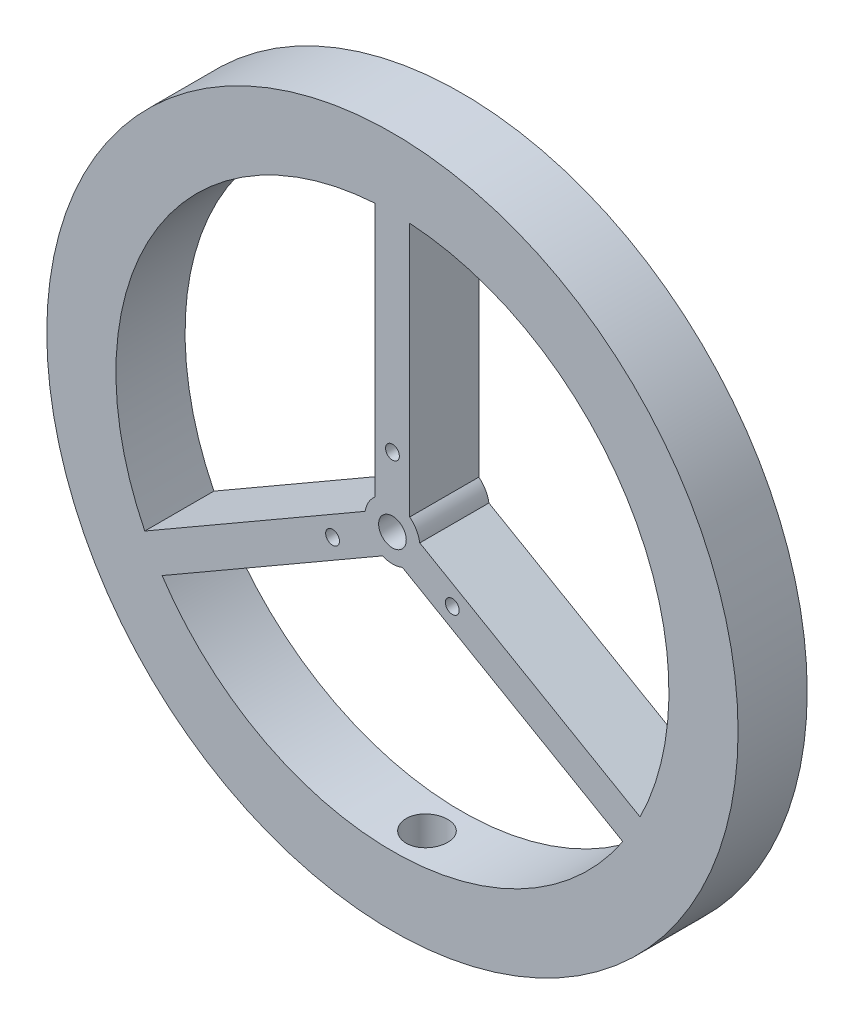
ISO-10303-21;
HEADER;
FILE_DESCRIPTION(('STEP AP214'),'2;1');
FILE_NAME('part.step','',(''),(''),'','','');
FILE_SCHEMA(('AUTOMOTIVE_DESIGN { 1 0 10303 214 1 1 1 1 }'));
ENDSEC;
DATA;
#1=APPLICATION_CONTEXT('core data for automotive mechanical design processes');
#2=APPLICATION_PROTOCOL_DEFINITION('international standard','automotive_design',2000,#1);
#3=PRODUCT_CONTEXT('',#1,'mechanical');
#4=PRODUCT('Part','Part','',(#3));
#5=PRODUCT_RELATED_PRODUCT_CATEGORY('part','',(#4));
#6=PRODUCT_DEFINITION_FORMATION('','',#4);
#7=PRODUCT_DEFINITION_CONTEXT('part definition',#1,'design');
#8=PRODUCT_DEFINITION('design','',#6,#7);
#9=PRODUCT_DEFINITION_SHAPE('','',#8);
#10=(LENGTH_UNIT() NAMED_UNIT(*) SI_UNIT(.MILLI.,.METRE.));
#11=(NAMED_UNIT(*) PLANE_ANGLE_UNIT() SI_UNIT($,.RADIAN.));
#12=(NAMED_UNIT(*) SI_UNIT($,.STERADIAN.) SOLID_ANGLE_UNIT());
#13=UNCERTAINTY_MEASURE_WITH_UNIT(LENGTH_MEASURE(1.E-05),#10,'distance_accuracy_value','');
#14=(GEOMETRIC_REPRESENTATION_CONTEXT(3) GLOBAL_UNCERTAINTY_ASSIGNED_CONTEXT((#13)) GLOBAL_UNIT_ASSIGNED_CONTEXT((#10,
#11,#12)) REPRESENTATION_CONTEXT('',''));
#15=CARTESIAN_POINT('',(0.,0.,0.));
#16=DIRECTION('',(0.,0.,1.));
#17=DIRECTION('',(1.,0.,0.));
#18=AXIS2_PLACEMENT_3D('',#15,#16,#17);
#19=CARTESIAN_POINT('',(0.,0.,10.));
#20=DIRECTION('',(0.,0.,1.));
#21=DIRECTION('',(1.,0.,0.));
#22=AXIS2_PLACEMENT_3D('',#19,#20,#21);
#23=PLANE('',#22);
#24=CARTESIAN_POINT('',(-8.66025403784439,-5.,10.));
#25=DIRECTION('',(0.,0.,1.));
#26=DIRECTION('',(1.,0.,0.));
#27=AXIS2_PLACEMENT_3D('',#24,#25,#26);
#28=CIRCLE('',#27,1.);
#29=CARTESIAN_POINT('',(-7.66025403784438,-5.,10.));
#30=VERTEX_POINT('',#29);
#31=EDGE_CURVE('E164',#30,#30,#28,.T.);
#32=ORIENTED_EDGE('',*,*,#31,.F.);
#33=EDGE_LOOP('',(#32));
#34=FACE_BOUND('',#33,.T.);
#35=CARTESIAN_POINT('',(0.,0.,10.));
#36=DIRECTION('',(0.,0.,1.));
#37=DIRECTION('',(1.,0.,0.));
#38=AXIS2_PLACEMENT_3D('',#35,#36,#37);
#39=CIRCLE('',#38,2.);
#40=CARTESIAN_POINT('',(2.,0.,10.));
#41=VERTEX_POINT('',#40);
#42=EDGE_CURVE('E407',#41,#41,#39,.T.);
#43=ORIENTED_EDGE('',*,*,#42,.F.);
#44=EDGE_LOOP('',(#43));
#45=FACE_BOUND('',#44,.T.);
#46=CARTESIAN_POINT('',(0.,10.,10.));
#47=DIRECTION('',(0.,0.,1.));
#48=DIRECTION('',(1.,0.,0.));
#49=AXIS2_PLACEMENT_3D('',#46,#47,#48);
#50=CIRCLE('',#49,1.);
#51=CARTESIAN_POINT('',(1.,10.,10.));
#52=VERTEX_POINT('',#51);
#53=EDGE_CURVE('E418',#52,#52,#50,.T.);
#54=ORIENTED_EDGE('',*,*,#53,.F.);
#55=EDGE_LOOP('',(#54));
#56=FACE_BOUND('',#55,.T.);
#57=CARTESIAN_POINT('',(8.66025403784439,-5.,10.));
#58=DIRECTION('',(0.,0.,1.));
#59=DIRECTION('',(1.,0.,0.));
#60=AXIS2_PLACEMENT_3D('',#57,#58,#59);
#61=CIRCLE('',#60,1.);
#62=CARTESIAN_POINT('',(9.66025403784439,-5.,10.));
#63=VERTEX_POINT('',#62);
#64=EDGE_CURVE('E406',#63,#63,#61,.T.);
#65=ORIENTED_EDGE('',*,*,#64,.F.);
#66=EDGE_LOOP('',(#65));
#67=FACE_BOUND('',#66,.T.);
#68=CARTESIAN_POINT('',(0.,0.,10.));
#69=DIRECTION('',(0.,0.,1.));
#70=DIRECTION('',(1.,0.,0.));
#71=AXIS2_PLACEMENT_3D('',#68,#69,#70);
#72=CIRCLE('',#71,50.);
#73=CARTESIAN_POINT('',(50.,0.,10.));
#74=VERTEX_POINT('',#73);
#75=EDGE_CURVE('E11',#74,#74,#72,.T.);
#76=ORIENTED_EDGE('',*,*,#75,.T.);
#77=EDGE_LOOP('',(#76));
#78=FACE_BOUND('',#77,.T.);
#79=DIRECTION('',(0.,-1.,0.));
#80=VECTOR('',#79,1.);
#81=CARTESIAN_POINT('',(2.5,39.9217985566783,10.));
#82=LINE('',#81,#80);
#83=CARTESIAN_POINT('',(2.5,39.9217985566783,10.));
#84=VERTEX_POINT('',#83);
#85=CARTESIAN_POINT('',(2.50000000000001,3.12249899919919,10.));
#86=VERTEX_POINT('',#85);
#87=EDGE_CURVE('E207',#84,#86,#82,.T.);
#88=ORIENTED_EDGE('',*,*,#87,.F.);
#89=CARTESIAN_POINT('',(0.,0.,10.));
#90=DIRECTION('',(0.,0.,1.));
#91=DIRECTION('',(1.,0.,0.));
#92=AXIS2_PLACEMENT_3D('',#89,#90,#91);
#93=CIRCLE('',#92,40.);
#94=CARTESIAN_POINT('',(35.823291714858,-17.7958357688586,10.));
#95=VERTEX_POINT('',#94);
#96=EDGE_CURVE('E205',#95,#84,#93,.T.);
#97=ORIENTED_EDGE('',*,*,#96,.F.);
#98=DIRECTION('',(0.866025403784695,-0.499999999999557,0.));
#99=VECTOR('',#98,1.);
#100=CARTESIAN_POINT('',(3.95416345659744,0.603814009865113,10.));
#101=LINE('',#100,#99);
#102=CARTESIAN_POINT('',(3.95416345659744,0.603814009865113,10.));
#103=VERTEX_POINT('',#102);
#104=EDGE_CURVE('E213',#103,#95,#101,.T.);
#105=ORIENTED_EDGE('',*,*,#104,.F.);
#106=CARTESIAN_POINT('',(0.,0.,10.));
#107=DIRECTION('',(0.,0.,-1.));
#108=DIRECTION('',(1.,0.,0.));
#109=AXIS2_PLACEMENT_3D('',#106,#107,#108);
#110=CIRCLE('',#109,4.);
#111=EDGE_CURVE('E210',#86,#103,#110,.T.);
#112=ORIENTED_EDGE('',*,*,#111,.F.);
#113=EDGE_LOOP('',(#88,#97,#105,#112));
#114=FACE_BOUND('',#113,.T.);
#115=DIRECTION('',(0.866025403784042,0.500000000000687,0.));
#116=VECTOR('',#115,1.);
#117=CARTESIAN_POINT('',(-35.8232917148353,-17.7958357689042,10.));
#118=LINE('',#117,#116);
#119=CARTESIAN_POINT('',(-35.8232917148353,-17.7958357689042,10.));
#120=VERTEX_POINT('',#119);
#121=CARTESIAN_POINT('',(-3.95416345659799,0.6038140098615,10.));
#122=VERTEX_POINT('',#121);
#123=EDGE_CURVE('E176',#120,#122,#118,.T.);
#124=ORIENTED_EDGE('',*,*,#123,.F.);
#125=CARTESIAN_POINT('',(0.,0.,10.));
#126=DIRECTION('',(0.,0.,1.));
#127=DIRECTION('',(1.,0.,0.));
#128=AXIS2_PLACEMENT_3D('',#125,#126,#127);
#129=CIRCLE('',#128,40.);
#130=CARTESIAN_POINT('',(-2.49999999998372,39.9217985566793,10.));
#131=VERTEX_POINT('',#130);
#132=EDGE_CURVE('E174',#131,#120,#129,.T.);
#133=ORIENTED_EDGE('',*,*,#132,.F.);
#134=DIRECTION('',(0.,1.,0.));
#135=VECTOR('',#134,1.);
#136=CARTESIAN_POINT('',(-2.49999999998372,39.9217985566793,10.));
#137=LINE('',#136,#135);
#138=CARTESIAN_POINT('',(-2.49999999998372,3.12249899921223,10.));
#139=VERTEX_POINT('',#138);
#140=EDGE_CURVE('E182',#139,#131,#137,.T.);
#141=ORIENTED_EDGE('',*,*,#140,.F.);
#142=CARTESIAN_POINT('',(0.,0.,10.));
#143=DIRECTION('',(0.,0.,-1.));
#144=DIRECTION('',(1.,0.,0.));
#145=AXIS2_PLACEMENT_3D('',#142,#143,#144);
#146=CIRCLE('',#145,4.);
#147=EDGE_CURVE('E179',#122,#139,#146,.T.);
#148=ORIENTED_EDGE('',*,*,#147,.F.);
#149=EDGE_LOOP('',(#124,#133,#141,#148));
#150=FACE_BOUND('',#149,.T.);
#151=DIRECTION('',(-0.866025403784695,0.499999999999557,0.));
#152=VECTOR('',#151,1.);
#153=CARTESIAN_POINT('',(33.3232917148584,-22.125962787785,10.));
#154=LINE('',#153,#152);
#155=CARTESIAN_POINT('',(33.3232917148584,-22.125962787785,10.));
#156=VERTEX_POINT('',#155);
#157=CARTESIAN_POINT('',(1.45416345659726,-3.72631300906098,10.));
#158=VERTEX_POINT('',#157);
#159=EDGE_CURVE('E144',#156,#158,#154,.T.);
#160=ORIENTED_EDGE('',*,*,#159,.F.);
#161=CARTESIAN_POINT('',(0.,0.,10.));
#162=DIRECTION('',(0.,0.,1.));
#163=DIRECTION('',(1.,0.,0.));
#164=AXIS2_PLACEMENT_3D('',#161,#162,#163);
#165=CIRCLE('',#164,40.);
#166=CARTESIAN_POINT('',(-33.3232917148302,-22.1259627878276,10.));
#167=VERTEX_POINT('',#166);
#168=EDGE_CURVE('E136',#167,#156,#165,.T.);
#169=ORIENTED_EDGE('',*,*,#168,.F.);
#170=DIRECTION('',(-0.866025403784042,-0.500000000000687,0.));
#171=VECTOR('',#170,1.);
#172=CARTESIAN_POINT('',(-1.4541634565937,-3.72631300906237,10.));
#173=LINE('',#172,#171);
#174=CARTESIAN_POINT('',(-1.45416345659371,-3.72631300906237,10.));
#175=VERTEX_POINT('',#174);
#176=EDGE_CURVE('E158',#175,#167,#173,.T.);
#177=ORIENTED_EDGE('',*,*,#176,.F.);
#178=CARTESIAN_POINT('',(0.,0.,10.));
#179=DIRECTION('',(0.,0.,-1.));
#180=DIRECTION('',(1.,0.,0.));
#181=AXIS2_PLACEMENT_3D('',#178,#179,#180);
#182=CIRCLE('',#181,4.);
#183=EDGE_CURVE('E156',#158,#175,#182,.T.);
#184=ORIENTED_EDGE('',*,*,#183,.F.);
#185=EDGE_LOOP('',(#160,#169,#177,#184));
#186=FACE_BOUND('',#185,.T.);
#187=ADVANCED_FACE('F39',(#34,#45,#56,#67,#78,#114,#150,#186),#23,.T.);
#188=CARTESIAN_POINT('',(0.,0.,0.));
#189=DIRECTION('',(0.,0.,1.));
#190=DIRECTION('',(1.,0.,0.));
#191=AXIS2_PLACEMENT_3D('',#188,#189,#190);
#192=PLANE('',#191);
#193=CARTESIAN_POINT('',(-8.66025403784439,-5.,0.));
#194=DIRECTION('',(0.,0.,1.));
#195=DIRECTION('',(1.,0.,0.));
#196=AXIS2_PLACEMENT_3D('',#193,#194,#195);
#197=CIRCLE('',#196,1.);
#198=CARTESIAN_POINT('',(-7.66025403784438,-5.,0.));
#199=VERTEX_POINT('',#198);
#200=EDGE_CURVE('E403',#199,#199,#197,.T.);
#201=ORIENTED_EDGE('',*,*,#200,.T.);
#202=EDGE_LOOP('',(#201));
#203=FACE_BOUND('',#202,.T.);
#204=CARTESIAN_POINT('',(0.,0.,0.));
#205=DIRECTION('',(0.,0.,1.));
#206=DIRECTION('',(1.,0.,0.));
#207=AXIS2_PLACEMENT_3D('',#204,#205,#206);
#208=CIRCLE('',#207,2.);
#209=CARTESIAN_POINT('',(2.,0.,0.));
#210=VERTEX_POINT('',#209);
#211=EDGE_CURVE('E400',#210,#210,#208,.T.);
#212=ORIENTED_EDGE('',*,*,#211,.T.);
#213=EDGE_LOOP('',(#212));
#214=FACE_BOUND('',#213,.T.);
#215=CARTESIAN_POINT('',(0.,10.,0.));
#216=DIRECTION('',(0.,0.,1.));
#217=DIRECTION('',(1.,0.,0.));
#218=AXIS2_PLACEMENT_3D('',#215,#216,#217);
#219=CIRCLE('',#218,1.);
#220=CARTESIAN_POINT('',(1.,10.,0.));
#221=VERTEX_POINT('',#220);
#222=EDGE_CURVE('E410',#221,#221,#219,.T.);
#223=ORIENTED_EDGE('',*,*,#222,.T.);
#224=EDGE_LOOP('',(#223));
#225=FACE_BOUND('',#224,.T.);
#226=CARTESIAN_POINT('',(8.66025403784439,-5.,0.));
#227=DIRECTION('',(0.,0.,1.));
#228=DIRECTION('',(1.,0.,0.));
#229=AXIS2_PLACEMENT_3D('',#226,#227,#228);
#230=CIRCLE('',#229,1.);
#231=CARTESIAN_POINT('',(9.66025403784439,-5.,0.));
#232=VERTEX_POINT('',#231);
#233=EDGE_CURVE('E415',#232,#232,#230,.T.);
#234=ORIENTED_EDGE('',*,*,#233,.T.);
#235=EDGE_LOOP('',(#234));
#236=FACE_BOUND('',#235,.T.);
#237=CARTESIAN_POINT('',(0.,0.,0.));
#238=DIRECTION('',(0.,0.,1.));
#239=DIRECTION('',(1.,0.,0.));
#240=AXIS2_PLACEMENT_3D('',#237,#238,#239);
#241=CIRCLE('',#240,40.);
#242=CARTESIAN_POINT('',(-2.49999999998372,39.9217985566793,0.));
#243=VERTEX_POINT('',#242);
#244=CARTESIAN_POINT('',(-35.8232917148353,-17.7958357689042,0.));
#245=VERTEX_POINT('',#244);
#246=EDGE_CURVE('E152',#243,#245,#241,.T.);
#247=ORIENTED_EDGE('',*,*,#246,.T.);
#248=DIRECTION('',(0.866025403784042,0.500000000000687,0.));
#249=VECTOR('',#248,1.);
#250=CARTESIAN_POINT('',(-35.8232917148353,-17.7958357689042,0.));
#251=LINE('',#250,#249);
#252=CARTESIAN_POINT('',(-3.95416345659799,0.6038140098615,0.));
#253=VERTEX_POINT('',#252);
#254=EDGE_CURVE('E187',#245,#253,#251,.T.);
#255=ORIENTED_EDGE('',*,*,#254,.T.);
#256=CARTESIAN_POINT('',(0.,0.,0.));
#257=DIRECTION('',(0.,0.,-1.));
#258=DIRECTION('',(1.,0.,0.));
#259=AXIS2_PLACEMENT_3D('',#256,#257,#258);
#260=CIRCLE('',#259,4.);
#261=CARTESIAN_POINT('',(-2.49999999998372,3.12249899921223,0.));
#262=VERTEX_POINT('',#261);
#263=EDGE_CURVE('E190',#253,#262,#260,.T.);
#264=ORIENTED_EDGE('',*,*,#263,.T.);
#265=DIRECTION('',(0.,1.,0.));
#266=VECTOR('',#265,1.);
#267=CARTESIAN_POINT('',(-2.49999999998372,39.9217985566793,0.));
#268=LINE('',#267,#266);
#269=EDGE_CURVE('E177',#262,#243,#268,.T.);
#270=ORIENTED_EDGE('',*,*,#269,.T.);
#271=EDGE_LOOP('',(#247,#255,#264,#270));
#272=FACE_BOUND('',#271,.T.);
#273=CARTESIAN_POINT('',(0.,0.,0.));
#274=DIRECTION('',(0.,0.,1.));
#275=DIRECTION('',(1.,0.,0.));
#276=AXIS2_PLACEMENT_3D('',#273,#274,#275);
#277=CIRCLE('',#276,50.);
#278=CARTESIAN_POINT('',(50.,0.,0.));
#279=VERTEX_POINT('',#278);
#280=EDGE_CURVE('E54',#279,#279,#277,.T.);
#281=ORIENTED_EDGE('',*,*,#280,.F.);
#282=EDGE_LOOP('',(#281));
#283=FACE_BOUND('',#282,.T.);
#284=CARTESIAN_POINT('',(0.,0.,0.));
#285=DIRECTION('',(0.,0.,1.));
#286=DIRECTION('',(1.,0.,0.));
#287=AXIS2_PLACEMENT_3D('',#284,#285,#286);
#288=CIRCLE('',#287,40.);
#289=CARTESIAN_POINT('',(35.823291714858,-17.7958357688586,0.));
#290=VERTEX_POINT('',#289);
#291=CARTESIAN_POINT('',(2.5,39.9217985566783,0.));
#292=VERTEX_POINT('',#291);
#293=EDGE_CURVE('E204',#290,#292,#288,.T.);
#294=ORIENTED_EDGE('',*,*,#293,.T.);
#295=DIRECTION('',(0.,-1.,0.));
#296=VECTOR('',#295,1.);
#297=CARTESIAN_POINT('',(2.5,39.9217985566783,0.));
#298=LINE('',#297,#296);
#299=CARTESIAN_POINT('',(2.50000000000001,3.12249899919919,0.));
#300=VERTEX_POINT('',#299);
#301=EDGE_CURVE('E218',#292,#300,#298,.T.);
#302=ORIENTED_EDGE('',*,*,#301,.T.);
#303=CARTESIAN_POINT('',(0.,0.,0.));
#304=DIRECTION('',(0.,0.,-1.));
#305=DIRECTION('',(1.,0.,0.));
#306=AXIS2_PLACEMENT_3D('',#303,#304,#305);
#307=CIRCLE('',#306,4.);
#308=CARTESIAN_POINT('',(3.95416345659744,0.603814009865113,0.));
#309=VERTEX_POINT('',#308);
#310=EDGE_CURVE('E221',#300,#309,#307,.T.);
#311=ORIENTED_EDGE('',*,*,#310,.T.);
#312=DIRECTION('',(0.866025403784695,-0.499999999999557,0.));
#313=VECTOR('',#312,1.);
#314=CARTESIAN_POINT('',(3.95416345659744,0.603814009865113,0.));
#315=LINE('',#314,#313);
#316=EDGE_CURVE('E208',#309,#290,#315,.T.);
#317=ORIENTED_EDGE('',*,*,#316,.T.);
#318=EDGE_LOOP('',(#294,#302,#311,#317));
#319=FACE_BOUND('',#318,.T.);
#320=CARTESIAN_POINT('',(0.,0.,0.));
#321=DIRECTION('',(0.,0.,1.));
#322=DIRECTION('',(1.,0.,0.));
#323=AXIS2_PLACEMENT_3D('',#320,#321,#322);
#324=CIRCLE('',#323,40.);
#325=CARTESIAN_POINT('',(-33.3232917148302,-22.1259627878276,0.));
#326=VERTEX_POINT('',#325);
#327=CARTESIAN_POINT('',(33.3232917148584,-22.125962787785,0.));
#328=VERTEX_POINT('',#327);
#329=EDGE_CURVE('E70',#326,#328,#324,.T.);
#330=ORIENTED_EDGE('',*,*,#329,.T.);
#331=DIRECTION('',(-0.866025403784695,0.499999999999557,0.));
#332=VECTOR('',#331,1.);
#333=CARTESIAN_POINT('',(33.3232917148584,-22.125962787785,0.));
#334=LINE('',#333,#332);
#335=CARTESIAN_POINT('',(1.45416345659726,-3.72631300906098,0.));
#336=VERTEX_POINT('',#335);
#337=EDGE_CURVE('E151',#328,#336,#334,.T.);
#338=ORIENTED_EDGE('',*,*,#337,.T.);
#339=CARTESIAN_POINT('',(0.,0.,0.));
#340=DIRECTION('',(0.,0.,-1.));
#341=DIRECTION('',(1.,0.,0.));
#342=AXIS2_PLACEMENT_3D('',#339,#340,#341);
#343=CIRCLE('',#342,4.);
#344=CARTESIAN_POINT('',(-1.4541634565937,-3.72631300906237,0.));
#345=VERTEX_POINT('',#344);
#346=EDGE_CURVE('E166',#336,#345,#343,.T.);
#347=ORIENTED_EDGE('',*,*,#346,.T.);
#348=DIRECTION('',(-0.866025403784042,-0.500000000000687,0.));
#349=VECTOR('',#348,1.);
#350=CARTESIAN_POINT('',(-1.4541634565937,-3.72631300906237,0.));
#351=LINE('',#350,#349);
#352=EDGE_CURVE('E145',#345,#326,#351,.T.);
#353=ORIENTED_EDGE('',*,*,#352,.T.);
#354=EDGE_LOOP('',(#330,#338,#347,#353));
#355=FACE_BOUND('',#354,.T.);
#356=ADVANCED_FACE('F238',(#203,#214,#225,#236,#272,#283,#319,#355),#192,.F.);
#357=CARTESIAN_POINT('',(0.,0.,10.));
#358=DIRECTION('',(0.,0.,-1.));
#359=DIRECTION('',(-1.,0.,0.));
#360=AXIS2_PLACEMENT_3D('',#357,#358,#359);
#361=CYLINDRICAL_SURFACE('',#360,50.);
#362=CARTESIAN_POINT('',(0.,-50.,8.));
#363=CARTESIAN_POINT('',(0.168348822581399,-49.9999988018792,7.99999258763597));
#364=CARTESIAN_POINT('',(0.336815851150842,-49.999140664501,7.98578172458759));
#365=CARTESIAN_POINT('',(0.669099098470568,-49.9957998840245,7.92929521686036));
#366=CARTESIAN_POINT('',(0.832909656661425,-49.9933153451289,7.88698681975665));
#367=CARTESIAN_POINT('',(1.15101866205461,-49.9870028601514,7.77552397023235));
#368=CARTESIAN_POINT('',(1.30532204101914,-49.9831756176013,7.70638357486628));
#369=CARTESIAN_POINT('',(1.60009227229221,-49.9746083096854,7.54324190388893));
#370=CARTESIAN_POINT('',(1.74056230437355,-49.969868454839,7.44924635994558));
#371=CARTESIAN_POINT('',(2.00391455668292,-49.9600014196855,7.238918854255));
#372=CARTESIAN_POINT('',(2.12677501456482,-49.9548737718816,7.12255966345505));
#373=CARTESIAN_POINT('',(2.35123456887539,-49.9448130655014,6.87086370136791));
#374=CARTESIAN_POINT('',(2.4528327812639,-49.9398800150231,6.73552614138998));
#375=CARTESIAN_POINT('',(2.63194973569807,-49.9307612505938,6.44959344347566));
#376=CARTESIAN_POINT('',(2.70945057811559,-49.9265760931575,6.29898707339185));
#377=CARTESIAN_POINT('',(2.83805824517835,-49.9194310673126,5.98687072084824));
#378=CARTESIAN_POINT('',(2.88916533543424,-49.9164711865737,5.82536084813316));
#379=CARTESIAN_POINT('',(2.96347483130237,-49.9121149150268,5.49623028413034));
#380=CARTESIAN_POINT('',(2.98671107999877,-49.9107166281448,5.32861725926855));
#381=CARTESIAN_POINT('',(3.00472376320145,-49.909635547992,4.99186444020422));
#382=CARTESIAN_POINT('',(2.99950049873284,-49.909952736576,4.82272466216952));
#383=CARTESIAN_POINT('',(2.96077052934292,-49.9122650773692,4.48795007484085));
#384=CARTESIAN_POINT('',(2.92730043443278,-49.9142580576144,4.32231101306083));
#385=CARTESIAN_POINT('',(2.83308367137872,-49.9196939576893,3.99900648166338));
#386=CARTESIAN_POINT('',(2.77233685026373,-49.9231368856506,3.84134105676858));
#387=CARTESIAN_POINT('',(2.62524939860049,-49.9310871744914,3.5383416535928));
#388=CARTESIAN_POINT('',(2.53889214250378,-49.9355952264307,3.39301576485279));
#389=CARTESIAN_POINT('',(2.34304724728294,-49.9451670244697,3.11890915074005));
#390=CARTESIAN_POINT('',(2.23355936918404,-49.9502307763104,2.99012859632808));
#391=CARTESIAN_POINT('',(1.99435490782794,-49.9603529513075,2.75255523784243));
#392=CARTESIAN_POINT('',(1.86460663669292,-49.9654113534036,2.64379433574738));
#393=CARTESIAN_POINT('',(1.5886756141567,-49.9749450683626,2.44959362579195));
#394=CARTESIAN_POINT('',(1.44249285742277,-49.9794203810364,2.36415382549892));
#395=CARTESIAN_POINT('',(1.13782325619254,-49.9872839197026,2.21902341998532));
#396=CARTESIAN_POINT('',(0.979335844609462,-49.990672095555,2.15933400235936));
#397=CARTESIAN_POINT('',(0.654564373168315,-49.995978863871,2.06741993685639));
#398=CARTESIAN_POINT('',(0.488280397263238,-49.9978974721549,2.035194993315));
#399=CARTESIAN_POINT('',(0.152912816242535,-50.0000468634742,1.99916410807519));
#400=CARTESIAN_POINT('',(-0.0161660336167584,-50.0002802663139,1.99531405484914));
#401=CARTESIAN_POINT('',(-0.352567197051339,-49.999039910399,2.01602701308576));
#402=CARTESIAN_POINT('',(-0.519889519036988,-49.9975661598221,2.04058988844295));
#403=CARTESIAN_POINT('',(-0.847903837225244,-49.9930791092507,2.11739493278883));
#404=CARTESIAN_POINT('',(-1.00860058400123,-49.9900669338165,2.16961688453256));
#405=CARTESIAN_POINT('',(-1.31894872475013,-49.9828419676559,2.30023716663921));
#406=CARTESIAN_POINT('',(-1.46860002710519,-49.9786291669722,2.37863571409745));
#407=CARTESIAN_POINT('',(-1.75281134781477,-49.9694699087962,2.55949617260101));
#408=CARTESIAN_POINT('',(-1.88735257402935,-49.9645225551179,2.6619875683063));
#409=CARTESIAN_POINT('',(-2.13733548380306,-49.9544540512103,2.88808141681832));
#410=CARTESIAN_POINT('',(-2.25277699361663,-49.9493328994006,3.01168406164826));
#411=CARTESIAN_POINT('',(-2.46143273645546,-49.9394864285097,3.27668197659848));
#412=CARTESIAN_POINT('',(-2.55461836871018,-49.9347616237717,3.41809978828684));
#413=CARTESIAN_POINT('',(-2.71592155646257,-49.9262488304085,3.71460028021574));
#414=CARTESIAN_POINT('',(-2.7840392567018,-49.9224608363742,3.86968288154977));
#415=CARTESIAN_POINT('',(-2.89322336739256,-49.9162525421034,4.18900593522784));
#416=CARTESIAN_POINT('',(-2.93430782950934,-49.9138313293413,4.3532401968271));
#417=CARTESIAN_POINT('',(-2.98831820088788,-49.9106271012001,4.68629069691671));
#418=CARTESIAN_POINT('',(-3.00124436350395,-49.9098440710814,4.85510689416724));
#419=CARTESIAN_POINT('',(-2.99856879119928,-49.910004867455,5.19224474968883));
#420=CARTESIAN_POINT('',(-2.98301202633421,-49.910945971812,5.36056676799569));
#421=CARTESIAN_POINT('',(-2.92390537491811,-49.9144432177817,5.69220424926454));
#422=CARTESIAN_POINT('',(-2.88035543701565,-49.916999362357,5.85551970304178));
#423=CARTESIAN_POINT('',(-2.76650860626632,-49.9234379688008,6.172515424042));
#424=CARTESIAN_POINT('',(-2.69621180749294,-49.9273204260043,6.32619572515132));
#425=CARTESIAN_POINT('',(-2.53087316901731,-49.9359740454718,6.61957796750719));
#426=CARTESIAN_POINT('',(-2.43583199596022,-49.9407451837925,6.7592802851982));
#427=CARTESIAN_POINT('',(-2.22353703117187,-49.9506472391796,7.02096842799459));
#428=CARTESIAN_POINT('',(-2.10625091260304,-49.9557786729136,7.1429280074223));
#429=CARTESIAN_POINT('',(-1.85283534216404,-49.9658187723384,7.36546816270886));
#430=CARTESIAN_POINT('',(-1.71670128156435,-49.9707273831532,7.46604349435789));
#431=CARTESIAN_POINT('',(-1.4293097362707,-49.9797734393622,7.64302831405202));
#432=CARTESIAN_POINT('',(-1.27803465586809,-49.983909971139,7.7194092458971));
#433=CARTESIAN_POINT('',(-0.96489334917229,-49.9909332355826,7.84559516341914));
#434=CARTESIAN_POINT('',(-0.8030398018436,-49.9938214339424,7.89543133190065));
#435=CARTESIAN_POINT('',(-0.533493890850571,-49.997264195671,7.9541342585253));
#436=CARTESIAN_POINT('',(-0.427544649469448,-49.9982855739166,7.97131173251705));
#437=CARTESIAN_POINT('',(-0.214412923480944,-49.9996538572287,7.99424695670325));
#438=CARTESIAN_POINT('',(-0.107230440432772,-50.0000007631477,8.00000472133424));
#439=CARTESIAN_POINT('',(0.,-50.,8.));
#440=B_SPLINE_CURVE_WITH_KNOTS('',3,(#362,#363,#364,#365,#366,#367,#368,#369,#370,#371,#372,
#373,#374,#375,#376,#377,#378,#379,#380,#381,#382,#383,#384,#385,#386,#387,#388,#389,#390,#391,
#392,#393,#394,#395,#396,#397,#398,#399,#400,#401,#402,#403,#404,#405,#406,#407,#408,#409,#410,
#411,#412,#413,#414,#415,#416,#417,#418,#419,#420,#421,#422,#423,#424,#425,#426,#427,#428,#429,
#430,#431,#432,#433,#434,#435,#436,#437,#438,#439),.UNSPECIFIED.,.T.,.F.,(4,2,2,2,2,2,2,2,2,2,2,
2,2,2,2,2,2,2,2,2,2,2,2,2,2,2,2,2,2,2,2,2,2,2,2,2,2,2,4),(0.,0.504655018154119,1.00989933198589,
1.51487930918969,2.01974293797511,2.52522520725135,3.03072848926021,3.53660636912441,
4.04247915804251,4.5477370504344,5.05298959856738,5.55758830538607,6.06218984208888,
6.56711967114725,7.0720547171598,7.57778755671523,8.08352056037323,8.5892768856885,
9.09502776629677,9.59999224178145,10.1049542983619,10.6095477641419,11.1141454148666,
11.6193638334128,12.1245868475576,12.6304556659689,13.1363215634619,13.641849321138,
14.1473725303091,14.6520982861269,15.1568249678299,15.6615498743355,16.166261184312,
16.6717116508603,17.1772859299822,17.683454724567,18.1890275911014,18.5104699834141,
18.8319119693663),.UNSPECIFIED.);
#441=CARTESIAN_POINT('',(0.,-50.,8.));
#442=VERTEX_POINT('',#441);
#443=EDGE_CURVE('E394',#442,#442,#440,.T.);
#444=ORIENTED_EDGE('',*,*,#443,.T.);
#445=EDGE_LOOP('',(#444));
#446=FACE_BOUND('',#445,.T.);
#447=ORIENTED_EDGE('',*,*,#75,.F.);
#448=EDGE_LOOP('',(#447));
#449=FACE_BOUND('',#448,.T.);
#450=ORIENTED_EDGE('',*,*,#280,.T.);
#451=EDGE_LOOP('',(#450));
#452=FACE_BOUND('',#451,.T.);
#453=ADVANCED_FACE('F41',(#446,#449,#452),#361,.T.);
#454=CARTESIAN_POINT('',(0.,0.,10.));
#455=DIRECTION('',(0.,0.,-1.));
#456=DIRECTION('',(-1.,0.,0.));
#457=AXIS2_PLACEMENT_3D('',#454,#455,#456);
#458=CYLINDRICAL_SURFACE('',#457,40.);
#459=ORIENTED_EDGE('',*,*,#293,.F.);
#460=DIRECTION('',(0.,0.,-1.));
#461=VECTOR('',#460,1.);
#462=CARTESIAN_POINT('',(35.823291714858,-17.7958357688586,10.));
#463=LINE('',#462,#461);
#464=EDGE_CURVE('E215',#95,#290,#463,.T.);
#465=ORIENTED_EDGE('',*,*,#464,.F.);
#466=ORIENTED_EDGE('',*,*,#96,.T.);
#467=DIRECTION('',(0.,0.,-1.));
#468=VECTOR('',#467,1.);
#469=CARTESIAN_POINT('',(2.5,39.9217985566783,10.));
#470=LINE('',#469,#468);
#471=EDGE_CURVE('E232',#84,#292,#470,.T.);
#472=ORIENTED_EDGE('',*,*,#471,.T.);
#473=EDGE_LOOP('',(#459,#465,#466,#472));
#474=FACE_BOUND('',#473,.T.);
#475=ADVANCED_FACE('F267',(#474),#458,.F.);
#476=CARTESIAN_POINT('',(2.5,39.9217985566783,10.));
#477=DIRECTION('',(1.,0.,0.));
#478=DIRECTION('',(0.,1.,0.));
#479=AXIS2_PLACEMENT_3D('',#476,#477,#478);
#480=PLANE('',#479);
#481=ORIENTED_EDGE('',*,*,#301,.F.);
#482=ORIENTED_EDGE('',*,*,#471,.F.);
#483=ORIENTED_EDGE('',*,*,#87,.T.);
#484=DIRECTION('',(0.,0.,-1.));
#485=VECTOR('',#484,1.);
#486=CARTESIAN_POINT('',(2.50000000000001,3.12249899919919,10.));
#487=LINE('',#486,#485);
#488=EDGE_CURVE('E230',#86,#300,#487,.T.);
#489=ORIENTED_EDGE('',*,*,#488,.T.);
#490=EDGE_LOOP('',(#481,#482,#483,#489));
#491=FACE_BOUND('',#490,.T.);
#492=ADVANCED_FACE('F270',(#491),#480,.T.);
#493=CARTESIAN_POINT('',(0.,0.,10.));
#494=DIRECTION('',(0.,0.,-1.));
#495=DIRECTION('',(-1.,0.,0.));
#496=AXIS2_PLACEMENT_3D('',#493,#494,#495);
#497=CYLINDRICAL_SURFACE('',#496,4.);
#498=ORIENTED_EDGE('',*,*,#310,.F.);
#499=ORIENTED_EDGE('',*,*,#488,.F.);
#500=ORIENTED_EDGE('',*,*,#111,.T.);
#501=DIRECTION('',(0.,0.,-1.));
#502=VECTOR('',#501,1.);
#503=CARTESIAN_POINT('',(3.95416345659744,0.603814009865113,10.));
#504=LINE('',#503,#502);
#505=EDGE_CURVE('E228',#103,#309,#504,.T.);
#506=ORIENTED_EDGE('',*,*,#505,.T.);
#507=EDGE_LOOP('',(#498,#499,#500,#506));
#508=FACE_BOUND('',#507,.T.);
#509=ADVANCED_FACE('F274',(#508),#497,.T.);
#510=CARTESIAN_POINT('',(3.95416345659744,0.603814009865113,10.));
#511=DIRECTION('',(0.499999999999557,0.866025403784695,0.));
#512=DIRECTION('',(-0.866025403784695,0.499999999999557,0.));
#513=AXIS2_PLACEMENT_3D('',#510,#511,#512);
#514=PLANE('',#513);
#515=ORIENTED_EDGE('',*,*,#316,.F.);
#516=ORIENTED_EDGE('',*,*,#505,.F.);
#517=ORIENTED_EDGE('',*,*,#104,.T.);
#518=ORIENTED_EDGE('',*,*,#464,.T.);
#519=EDGE_LOOP('',(#515,#516,#517,#518));
#520=FACE_BOUND('',#519,.T.);
#521=ADVANCED_FACE('F278',(#520),#514,.T.);
#522=CARTESIAN_POINT('',(0.,0.,10.));
#523=DIRECTION('',(0.,0.,-1.));
#524=DIRECTION('',(-1.,0.,0.));
#525=AXIS2_PLACEMENT_3D('',#522,#523,#524);
#526=CYLINDRICAL_SURFACE('',#525,40.);
#527=ORIENTED_EDGE('',*,*,#246,.F.);
#528=DIRECTION('',(0.,0.,-1.));
#529=VECTOR('',#528,1.);
#530=CARTESIAN_POINT('',(-2.49999999998372,39.9217985566793,10.));
#531=LINE('',#530,#529);
#532=EDGE_CURVE('E184',#131,#243,#531,.T.);
#533=ORIENTED_EDGE('',*,*,#532,.F.);
#534=ORIENTED_EDGE('',*,*,#132,.T.);
#535=DIRECTION('',(0.,0.,-1.));
#536=VECTOR('',#535,1.);
#537=CARTESIAN_POINT('',(-35.8232917148353,-17.7958357689042,10.));
#538=LINE('',#537,#536);
#539=EDGE_CURVE('E201',#120,#245,#538,.T.);
#540=ORIENTED_EDGE('',*,*,#539,.T.);
#541=EDGE_LOOP('',(#527,#533,#534,#540));
#542=FACE_BOUND('',#541,.T.);
#543=ADVANCED_FACE('F282',(#542),#526,.F.);
#544=CARTESIAN_POINT('',(-35.8232917148353,-17.7958357689042,10.));
#545=DIRECTION('',(-0.500000000000687,0.866025403784042,0.));
#546=DIRECTION('',(-0.866025403784042,-0.500000000000687,0.));
#547=AXIS2_PLACEMENT_3D('',#544,#545,#546);
#548=PLANE('',#547);
#549=ORIENTED_EDGE('',*,*,#254,.F.);
#550=ORIENTED_EDGE('',*,*,#539,.F.);
#551=ORIENTED_EDGE('',*,*,#123,.T.);
#552=DIRECTION('',(0.,0.,-1.));
#553=VECTOR('',#552,1.);
#554=CARTESIAN_POINT('',(-3.95416345659799,0.6038140098615,10.));
#555=LINE('',#554,#553);
#556=EDGE_CURVE('E199',#122,#253,#555,.T.);
#557=ORIENTED_EDGE('',*,*,#556,.T.);
#558=EDGE_LOOP('',(#549,#550,#551,#557));
#559=FACE_BOUND('',#558,.T.);
#560=ADVANCED_FACE('F286',(#559),#548,.T.);
#561=CARTESIAN_POINT('',(0.,0.,10.));
#562=DIRECTION('',(0.,0.,-1.));
#563=DIRECTION('',(-1.,0.,0.));
#564=AXIS2_PLACEMENT_3D('',#561,#562,#563);
#565=CYLINDRICAL_SURFACE('',#564,4.);
#566=ORIENTED_EDGE('',*,*,#263,.F.);
#567=ORIENTED_EDGE('',*,*,#556,.F.);
#568=ORIENTED_EDGE('',*,*,#147,.T.);
#569=DIRECTION('',(0.,0.,-1.));
#570=VECTOR('',#569,1.);
#571=CARTESIAN_POINT('',(-2.49999999998372,3.12249899921223,10.));
#572=LINE('',#571,#570);
#573=EDGE_CURVE('E197',#139,#262,#572,.T.);
#574=ORIENTED_EDGE('',*,*,#573,.T.);
#575=EDGE_LOOP('',(#566,#567,#568,#574));
#576=FACE_BOUND('',#575,.T.);
#577=ADVANCED_FACE('F290',(#576),#565,.T.);
#578=CARTESIAN_POINT('',(-2.49999999998372,39.9217985566793,10.));
#579=DIRECTION('',(-1.,0.,0.));
#580=DIRECTION('',(0.,-1.,0.));
#581=AXIS2_PLACEMENT_3D('',#578,#579,#580);
#582=PLANE('',#581);
#583=ORIENTED_EDGE('',*,*,#269,.F.);
#584=ORIENTED_EDGE('',*,*,#573,.F.);
#585=ORIENTED_EDGE('',*,*,#140,.T.);
#586=ORIENTED_EDGE('',*,*,#532,.T.);
#587=EDGE_LOOP('',(#583,#584,#585,#586));
#588=FACE_BOUND('',#587,.T.);
#589=ADVANCED_FACE('F294',(#588),#582,.T.);
#590=CARTESIAN_POINT('',(0.,0.,10.));
#591=DIRECTION('',(0.,0.,-1.));
#592=DIRECTION('',(-1.,0.,0.));
#593=AXIS2_PLACEMENT_3D('',#590,#591,#592);
#594=CYLINDRICAL_SURFACE('',#593,40.);
#595=CARTESIAN_POINT('',(0.,-40.,8.));
#596=CARTESIAN_POINT('',(0.168257619022887,-39.9999985165458,7.99999262636595));
#597=CARTESIAN_POINT('',(0.336631202048175,-39.9989270181516,7.98579709311882));
#598=CARTESIAN_POINT('',(0.668723883943076,-39.9947556157596,7.92937503091344));
#599=CARTESIAN_POINT('',(0.832437422325988,-39.9916533864778,7.88711636752603));
#600=CARTESIAN_POINT('',(1.15035193191964,-39.9837712537186,7.77579334376054));
#601=CARTESIAN_POINT('',(1.30455807387018,-39.9789922718022,7.706743705783));
#602=CARTESIAN_POINT('',(1.59915296135604,-39.9682932494129,7.54382409427254));
#603=CARTESIAN_POINT('',(1.7395447435997,-39.9623734605654,7.44995959240806));
#604=CARTESIAN_POINT('',(2.00285791506509,-39.9500437379781,7.23986155892498));
#605=CARTESIAN_POINT('',(2.12574645943705,-39.943632916582,7.12358691183155));
#606=CARTESIAN_POINT('',(2.35028330739564,-39.9310511676876,6.87205540531016));
#607=CARTESIAN_POINT('',(2.45193069808533,-39.9248802505092,6.73679773045186));
#608=CARTESIAN_POINT('',(2.63120767749532,-39.9134670791955,6.4509450903812));
#609=CARTESIAN_POINT('',(2.70880893620664,-39.908225923544,6.30033230993982));
#610=CARTESIAN_POINT('',(2.83760978093564,-39.8992752242033,5.98816925531241));
#611=CARTESIAN_POINT('',(2.88880975377375,-39.895565658074,5.82661914141478));
#612=CARTESIAN_POINT('',(2.96326075315856,-39.8901051778004,5.4974922151989));
#613=CARTESIAN_POINT('',(2.98656462088434,-39.8883505610028,5.32992741838477));
#614=CARTESIAN_POINT('',(3.00472509149676,-39.8869867785079,4.99325609347861));
#615=CARTESIAN_POINT('',(2.99958213621715,-39.8873775794881,4.82414958937298));
#616=CARTESIAN_POINT('',(2.96103868835137,-39.8902571273862,4.48955637789223));
#617=CARTESIAN_POINT('',(2.92769551352788,-39.8927416187808,4.32406302607165));
#618=CARTESIAN_POINT('',(2.83378710453841,-39.8995219039609,4.00102860576883));
#619=CARTESIAN_POINT('',(2.77322164894672,-39.9038177124796,3.84348760198248));
#620=CARTESIAN_POINT('',(2.62652334379402,-39.9137414707227,3.54064656752232));
#621=CARTESIAN_POINT('',(2.54036465452993,-39.9193707656063,3.39535909964638));
#622=CARTESIAN_POINT('',(2.34494427486846,-39.9313258919028,3.12128667427026));
#623=CARTESIAN_POINT('',(2.23568220685754,-39.9376517346997,2.9925019865553));
#624=CARTESIAN_POINT('',(1.99683455686455,-39.9503060672294,2.75475748351284));
#625=CARTESIAN_POINT('',(1.86719940035263,-39.9566345248459,2.64584746481056));
#626=CARTESIAN_POINT('',(1.59145875186888,-39.9685660304199,2.45132847286861));
#627=CARTESIAN_POINT('',(1.44535325143718,-39.9741690780047,2.36571951159745));
#628=CARTESIAN_POINT('',(1.14078788043267,-39.9840192083857,2.22023633951247));
#629=CARTESIAN_POINT('',(0.982327018857955,-39.9882661822741,2.16036419551741));
#630=CARTESIAN_POINT('',(0.657563305549084,-39.9949243000265,2.06808837559031));
#631=CARTESIAN_POINT('',(0.491260585685144,-39.99733547475,2.03568423792468));
#632=CARTESIAN_POINT('',(0.1559656875675,-40.0000463470774,1.99932638092211));
#633=CARTESIAN_POINT('',(-0.0130189896506441,-40.0003511515157,1.99530385069164));
#634=CARTESIAN_POINT('',(-0.349260461986129,-39.9988285542728,2.01564333613942));
#635=CARTESIAN_POINT('',(-0.516517270109197,-39.9970011686525,2.04000513801061));
#636=CARTESIAN_POINT('',(-0.844360022353009,-39.9914230750648,2.11636473762116));
#637=CARTESIAN_POINT('',(-1.00495340329214,-39.9876745772022,2.16833078111734));
#638=CARTESIAN_POINT('',(-1.31514065476806,-39.9786756181681,2.29839138727344));
#639=CARTESIAN_POINT('',(-1.4647343835988,-39.9734251376511,2.37648628647364));
#640=CARTESIAN_POINT('',(-1.74898991875352,-39.9619986511672,2.55676167579574));
#641=CARTESIAN_POINT('',(-1.8836226405111,-39.9558208954995,2.65898791343766));
#642=CARTESIAN_POINT('',(-2.13384119203404,-39.9432403278502,2.88455785093816));
#643=CARTESIAN_POINT('',(-2.24942675346961,-39.9368375126997,3.00790184824652));
#644=CARTESIAN_POINT('',(-2.45850469958308,-39.9245134751873,3.27250388026424));
#645=CARTESIAN_POINT('',(-2.55195229417531,-39.9185932448018,3.41379735886597));
#646=CARTESIAN_POINT('',(-2.71379488945216,-39.9079180570866,3.71011039676308));
#647=CARTESIAN_POINT('',(-2.78219009917378,-39.903163090034,3.86512984151567));
#648=CARTESIAN_POINT('',(-2.89190958476916,-39.8953619134742,4.18433361497461));
#649=CARTESIAN_POINT('',(-2.93326161345821,-39.8923139526305,4.34850835970545));
#650=CARTESIAN_POINT('',(-2.98781138678354,-39.8882657304882,4.68149446203144));
#651=CARTESIAN_POINT('',(-3.00100955814776,-39.887265438153,4.85030574931126));
#652=CARTESIAN_POINT('',(-2.9988724310631,-39.8874261383252,5.18732782649481));
#653=CARTESIAN_POINT('',(-2.98360752171447,-39.8885817991714,5.35553906979228));
#654=CARTESIAN_POINT('',(-2.92512396386795,-39.892912873915,5.68700216742));
#655=CARTESIAN_POINT('',(-2.88190526886769,-39.8960882911723,5.85025401349961));
#656=CARTESIAN_POINT('',(-2.76875800547052,-39.904099707112,6.16717121684359));
#657=CARTESIAN_POINT('',(-2.69883031681908,-39.908935651099,6.32083688966508));
#658=CARTESIAN_POINT('',(-2.53425849239365,-39.9197232475816,6.61425791542913));
#659=CARTESIAN_POINT('',(-2.43961485362016,-39.9256748776417,6.7540135480036));
#660=CARTESIAN_POINT('',(-2.22803417893455,-39.9380406158325,7.01600669994207));
#661=CARTESIAN_POINT('',(-2.11104537640002,-39.9444557759261,7.1382023632802));
#662=CARTESIAN_POINT('',(-1.85818194690543,-39.9570162658315,7.36126810062168));
#663=CARTESIAN_POINT('',(-1.72230273559137,-39.9631615296667,7.46213298301213));
#664=CARTESIAN_POINT('',(-1.43530083320768,-39.9744988045533,7.63978232507822));
#665=CARTESIAN_POINT('',(-1.28415429653489,-39.9796892875503,7.71652832098206));
#666=CARTESIAN_POINT('',(-0.971187835830419,-39.9885133439152,7.84345656888061));
#667=CARTESIAN_POINT('',(-0.809380527475333,-39.9921487206811,7.8936696061365));
#668=CARTESIAN_POINT('',(-0.53883583344874,-39.9965112401159,7.95320397705389));
#669=CARTESIAN_POINT('',(-0.431842385876087,-39.9978136309276,7.97072943757883));
#670=CARTESIAN_POINT('',(-0.21658197589598,-39.9995584874585,7.99412981030463));
#671=CARTESIAN_POINT('',(-0.108315016138137,-40.0000009549664,8.00000474674071));
#672=CARTESIAN_POINT('',(0.,-40.,8.));
#673=B_SPLINE_CURVE_WITH_KNOTS('',3,(#595,#596,#597,#598,#599,#600,#601,#602,#603,#604,#605,
#606,#607,#608,#609,#610,#611,#612,#613,#614,#615,#616,#617,#618,#619,#620,#621,#622,#623,#624,
#625,#626,#627,#628,#629,#630,#631,#632,#633,#634,#635,#636,#637,#638,#639,#640,#641,#642,#643,
#644,#645,#646,#647,#648,#649,#650,#651,#652,#653,#654,#655,#656,#657,#658,#659,#660,#661,#662,
#663,#664,#665,#666,#667,#668,#669,#670,#671,#672),.UNSPECIFIED.,.T.,.F.,(4,2,2,2,2,2,2,2,2,2,2,
2,2,2,2,2,2,2,2,2,2,2,2,2,2,2,2,2,2,2,2,2,2,2,2,2,2,2,4),(0.,0.504377412682807,1.00933337423215,
1.51401224027407,2.01857991749138,2.52408228266881,3.02960636873345,3.53572379442509,
4.04183380448848,4.54698360940742,5.05212556840274,5.5562432723286,6.0603650768158,
6.56499759796794,7.06963836773243,7.57552667274627,8.08141523760734,8.58734442072854,
9.09326509907796,9.59795875553063,10.1026486103661,10.6067591539046,11.1108761906485,
11.6159567042388,12.1210443326201,12.6271453023128,13.1332420490051,13.6388186001384,
14.1443874881947,14.6487077640481,15.1530288788631,15.657333383694,16.1616277485024,
16.6671048925629,17.1727049214422,17.6791072154342,18.1849206512445,18.5096118096951,
18.8343022927277),.UNSPECIFIED.);
#674=CARTESIAN_POINT('',(0.,-40.,8.));
#675=VERTEX_POINT('',#674);
#676=EDGE_CURVE('E44',#675,#675,#673,.T.);
#677=ORIENTED_EDGE('',*,*,#676,.F.);
#678=EDGE_LOOP('',(#677));
#679=FACE_BOUND('',#678,.T.);
#680=ORIENTED_EDGE('',*,*,#329,.F.);
#681=DIRECTION('',(0.,0.,-1.));
#682=VECTOR('',#681,1.);
#683=CARTESIAN_POINT('',(-33.3232917148302,-22.1259627878276,10.));
#684=LINE('',#683,#682);
#685=EDGE_CURVE('E140',#167,#326,#684,.T.);
#686=ORIENTED_EDGE('',*,*,#685,.F.);
#687=ORIENTED_EDGE('',*,*,#168,.T.);
#688=DIRECTION('',(0.,0.,-1.));
#689=VECTOR('',#688,1.);
#690=CARTESIAN_POINT('',(33.3232917148584,-22.125962787785,10.));
#691=LINE('',#690,#689);
#692=EDGE_CURVE('E139',#156,#328,#691,.T.);
#693=ORIENTED_EDGE('',*,*,#692,.T.);
#694=EDGE_LOOP('',(#680,#686,#687,#693));
#695=FACE_BOUND('',#694,.T.);
#696=ADVANCED_FACE('F138',(#679,#695),#594,.F.);
#697=CARTESIAN_POINT('',(33.3232917148584,-22.125962787785,10.));
#698=DIRECTION('',(-0.499999999999557,-0.866025403784695,0.));
#699=DIRECTION('',(0.866025403784695,-0.499999999999557,0.));
#700=AXIS2_PLACEMENT_3D('',#697,#698,#699);
#701=PLANE('',#700);
#702=ORIENTED_EDGE('',*,*,#337,.F.);
#703=ORIENTED_EDGE('',*,*,#692,.F.);
#704=ORIENTED_EDGE('',*,*,#159,.T.);
#705=DIRECTION('',(0.,0.,-1.));
#706=VECTOR('',#705,1.);
#707=CARTESIAN_POINT('',(1.45416345659726,-3.72631300906098,10.));
#708=LINE('',#707,#706);
#709=EDGE_CURVE('E153',#158,#336,#708,.T.);
#710=ORIENTED_EDGE('',*,*,#709,.T.);
#711=EDGE_LOOP('',(#702,#703,#704,#710));
#712=FACE_BOUND('',#711,.T.);
#713=ADVANCED_FACE('F148',(#712),#701,.T.);
#714=CARTESIAN_POINT('',(0.,0.,10.));
#715=DIRECTION('',(0.,0.,-1.));
#716=DIRECTION('',(-1.,0.,0.));
#717=AXIS2_PLACEMENT_3D('',#714,#715,#716);
#718=CYLINDRICAL_SURFACE('',#717,4.);
#719=ORIENTED_EDGE('',*,*,#346,.F.);
#720=ORIENTED_EDGE('',*,*,#709,.F.);
#721=ORIENTED_EDGE('',*,*,#183,.T.);
#722=DIRECTION('',(0.,0.,-1.));
#723=VECTOR('',#722,1.);
#724=CARTESIAN_POINT('',(-1.4541634565937,-3.72631300906237,10.));
#725=LINE('',#724,#723);
#726=EDGE_CURVE('E62',#175,#345,#725,.T.);
#727=ORIENTED_EDGE('',*,*,#726,.T.);
#728=EDGE_LOOP('',(#719,#720,#721,#727));
#729=FACE_BOUND('',#728,.T.);
#730=ADVANCED_FACE('F247',(#729),#718,.T.);
#731=CARTESIAN_POINT('',(-1.4541634565937,-3.72631300906237,10.));
#732=DIRECTION('',(0.500000000000687,-0.866025403784042,0.));
#733=DIRECTION('',(0.866025403784042,0.500000000000687,0.));
#734=AXIS2_PLACEMENT_3D('',#731,#732,#733);
#735=PLANE('',#734);
#736=ORIENTED_EDGE('',*,*,#352,.F.);
#737=ORIENTED_EDGE('',*,*,#726,.F.);
#738=ORIENTED_EDGE('',*,*,#176,.T.);
#739=ORIENTED_EDGE('',*,*,#685,.T.);
#740=EDGE_LOOP('',(#736,#737,#738,#739));
#741=FACE_BOUND('',#740,.T.);
#742=ADVANCED_FACE('F244',(#741),#735,.T.);
#743=CARTESIAN_POINT('',(8.66025403784439,-5.,10.));
#744=DIRECTION('',(0.,0.,-1.));
#745=DIRECTION('',(-1.,0.,0.));
#746=AXIS2_PLACEMENT_3D('',#743,#744,#745);
#747=CYLINDRICAL_SURFACE('',#746,1.);
#748=ORIENTED_EDGE('',*,*,#64,.T.);
#749=EDGE_LOOP('',(#748));
#750=FACE_BOUND('',#749,.T.);
#751=ORIENTED_EDGE('',*,*,#233,.F.);
#752=EDGE_LOOP('',(#751));
#753=FACE_BOUND('',#752,.T.);
#754=ADVANCED_FACE('F246',(#750,#753),#747,.F.);
#755=CARTESIAN_POINT('',(0.,10.,10.));
#756=DIRECTION('',(0.,0.,-1.));
#757=DIRECTION('',(-1.,0.,0.));
#758=AXIS2_PLACEMENT_3D('',#755,#756,#757);
#759=CYLINDRICAL_SURFACE('',#758,1.);
#760=ORIENTED_EDGE('',*,*,#53,.T.);
#761=EDGE_LOOP('',(#760));
#762=FACE_BOUND('',#761,.T.);
#763=ORIENTED_EDGE('',*,*,#222,.F.);
#764=EDGE_LOOP('',(#763));
#765=FACE_BOUND('',#764,.T.);
#766=ADVANCED_FACE('F253',(#762,#765),#759,.F.);
#767=CARTESIAN_POINT('',(0.,0.,10.));
#768=DIRECTION('',(0.,0.,-1.));
#769=DIRECTION('',(-1.,0.,0.));
#770=AXIS2_PLACEMENT_3D('',#767,#768,#769);
#771=CYLINDRICAL_SURFACE('',#770,2.);
#772=ORIENTED_EDGE('',*,*,#42,.T.);
#773=EDGE_LOOP('',(#772));
#774=FACE_BOUND('',#773,.T.);
#775=ORIENTED_EDGE('',*,*,#211,.F.);
#776=EDGE_LOOP('',(#775));
#777=FACE_BOUND('',#776,.T.);
#778=ADVANCED_FACE('F345',(#774,#777),#771,.F.);
#779=CARTESIAN_POINT('',(-8.66025403784439,-5.,10.));
#780=DIRECTION('',(0.,0.,-1.));
#781=DIRECTION('',(-1.,0.,0.));
#782=AXIS2_PLACEMENT_3D('',#779,#780,#781);
#783=CYLINDRICAL_SURFACE('',#782,1.);
#784=ORIENTED_EDGE('',*,*,#31,.T.);
#785=EDGE_LOOP('',(#784));
#786=FACE_BOUND('',#785,.T.);
#787=ORIENTED_EDGE('',*,*,#200,.F.);
#788=EDGE_LOOP('',(#787));
#789=FACE_BOUND('',#788,.T.);
#790=ADVANCED_FACE('F354',(#786,#789),#783,.F.);
#791=CARTESIAN_POINT('',(0.,-50.,5.));
#792=DIRECTION('',(0.,1.,0.));
#793=DIRECTION('',(0.,0.,1.));
#794=AXIS2_PLACEMENT_3D('',#791,#792,#793);
#795=CYLINDRICAL_SURFACE('',#794,3.);
#796=ORIENTED_EDGE('',*,*,#676,.T.);
#797=EDGE_LOOP('',(#796));
#798=FACE_BOUND('',#797,.T.);
#799=ORIENTED_EDGE('',*,*,#443,.F.);
#800=EDGE_LOOP('',(#799));
#801=FACE_BOUND('',#800,.T.);
#802=ADVANCED_FACE('F364',(#798,#801),#795,.F.);
#803=CLOSED_SHELL('',(#187,#356,#453,#475,#492,#509,#521,#543,#560,#577,#589,#696,#713,#730,
#742,#754,#766,#778,#790,#802));
#804=MANIFOLD_SOLID_BREP('B2',#803);
#805=ADVANCED_BREP_SHAPE_REPRESENTATION('',(#18,#804),#14);
#806=SHAPE_DEFINITION_REPRESENTATION(#9,#805);
ENDSEC;
END-ISO-10303-21;
